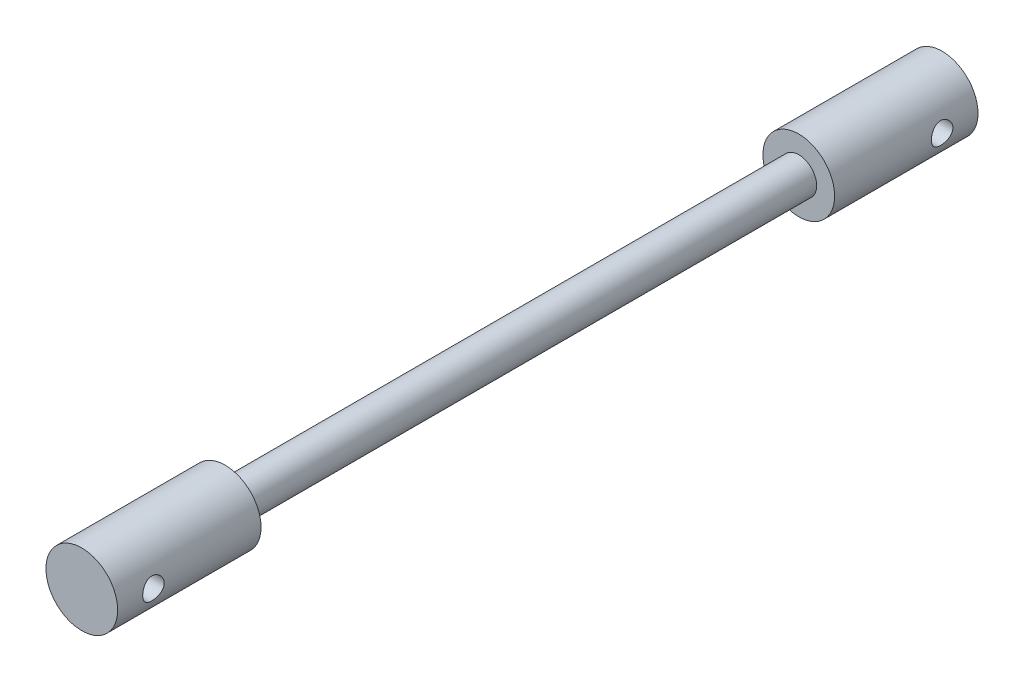
ISO-10303-21;
HEADER;
FILE_DESCRIPTION(('STEP AP214'),'2;1');
FILE_NAME('part.step','',(''),(''),'','','');
FILE_SCHEMA(('AUTOMOTIVE_DESIGN { 1 0 10303 214 1 1 1 1 }'));
ENDSEC;
DATA;
#1=APPLICATION_CONTEXT('core data for automotive mechanical design processes');
#2=APPLICATION_PROTOCOL_DEFINITION('international standard','automotive_design',2000,#1);
#3=PRODUCT_CONTEXT('',#1,'mechanical');
#4=PRODUCT('Part','Part','',(#3));
#5=PRODUCT_RELATED_PRODUCT_CATEGORY('part','',(#4));
#6=PRODUCT_DEFINITION_FORMATION('','',#4);
#7=PRODUCT_DEFINITION_CONTEXT('part definition',#1,'design');
#8=PRODUCT_DEFINITION('design','',#6,#7);
#9=PRODUCT_DEFINITION_SHAPE('','',#8);
#10=(LENGTH_UNIT() NAMED_UNIT(*) SI_UNIT(.MILLI.,.METRE.));
#11=(NAMED_UNIT(*) PLANE_ANGLE_UNIT() SI_UNIT($,.RADIAN.));
#12=(NAMED_UNIT(*) SI_UNIT($,.STERADIAN.) SOLID_ANGLE_UNIT());
#13=UNCERTAINTY_MEASURE_WITH_UNIT(LENGTH_MEASURE(1.E-05),#10,'distance_accuracy_value','');
#14=(GEOMETRIC_REPRESENTATION_CONTEXT(3) GLOBAL_UNCERTAINTY_ASSIGNED_CONTEXT((#13)) GLOBAL_UNIT_ASSIGNED_CONTEXT((#10,
#11,#12)) REPRESENTATION_CONTEXT('',''));
#15=CARTESIAN_POINT('',(0.,0.,0.));
#16=DIRECTION('',(0.,0.,1.));
#17=DIRECTION('',(1.,0.,0.));
#18=AXIS2_PLACEMENT_3D('',#15,#16,#17);
#19=CARTESIAN_POINT('',(0.,0.,20.));
#20=DIRECTION('',(0.,0.,1.));
#21=DIRECTION('',(1.,0.,0.));
#22=AXIS2_PLACEMENT_3D('',#19,#20,#21);
#23=PLANE('',#22);
#24=CARTESIAN_POINT('',(0.,0.,20.));
#25=DIRECTION('',(0.,0.,1.));
#26=DIRECTION('',(1.,0.,0.));
#27=AXIS2_PLACEMENT_3D('',#24,#25,#26);
#28=CIRCLE('',#27,5.);
#29=CARTESIAN_POINT('',(5.,0.,20.));
#30=VERTEX_POINT('',#29);
#31=EDGE_CURVE('E101',#30,#30,#28,.T.);
#32=ORIENTED_EDGE('',*,*,#31,.T.);
#33=EDGE_LOOP('',(#32));
#34=FACE_BOUND('',#33,.T.);
#35=CARTESIAN_POINT('',(0.,0.,20.));
#36=DIRECTION('',(0.,0.,1.));
#37=DIRECTION('',(1.,0.,0.));
#38=AXIS2_PLACEMENT_3D('',#35,#36,#37);
#39=CIRCLE('',#38,2.5);
#40=CARTESIAN_POINT('',(2.5,0.,20.));
#41=VERTEX_POINT('',#40);
#42=EDGE_CURVE('E102',#41,#41,#39,.T.);
#43=ORIENTED_EDGE('',*,*,#42,.F.);
#44=EDGE_LOOP('',(#43));
#45=FACE_BOUND('',#44,.T.);
#46=ADVANCED_FACE('F31',(#34,#45),#23,.T.);
#47=CARTESIAN_POINT('',(0.,0.,20.));
#48=DIRECTION('',(0.,0.,-1.));
#49=DIRECTION('',(-1.,0.,0.));
#50=AXIS2_PLACEMENT_3D('',#47,#48,#49);
#51=CYLINDRICAL_SURFACE('',#50,5.);
#52=CARTESIAN_POINT('',(-5.,0.,3.5));
#53=CARTESIAN_POINT('',(-4.9999992925055,0.0822886127532998,3.50000099748489));
#54=CARTESIAN_POINT('',(-4.99794915693954,0.164587318351529,3.50679386362397));
#55=CARTESIAN_POINT('',(-4.98997105593691,0.32678812530488,3.5337213542221));
#56=CARTESIAN_POINT('',(-4.98404193389692,0.406689504411419,3.55385995802334));
#57=CARTESIAN_POINT('',(-4.96895552501836,0.561732707754526,3.60674601691027));
#58=CARTESIAN_POINT('',(-4.95980300250425,0.636881364395372,3.63947486961894));
#59=CARTESIAN_POINT('',(-4.93922109237645,0.78062418105313,3.71653609305584));
#60=CARTESIAN_POINT('',(-4.92779140192067,0.849217467469668,3.76087000739542));
#61=CARTESIAN_POINT('',(-4.90350737192774,0.979871797183744,3.86122400747267));
#62=CARTESIAN_POINT('',(-4.89062383657036,1.04171807124434,3.91751662588591));
#63=CARTESIAN_POINT('',(-4.86505834210442,1.15524920923324,4.03960922991018));
#64=CARTESIAN_POINT('',(-4.85237641724501,1.20693236327441,4.10541081212496));
#65=CARTESIAN_POINT('',(-4.82834113993772,1.29980037723707,4.24647075303761));
#66=CARTESIAN_POINT('',(-4.81702406663875,1.34072309022213,4.32190846099074));
#67=CARTESIAN_POINT('',(-4.79743620394031,1.4092139477476,4.47898925423029));
#68=CARTESIAN_POINT('',(-4.78916468313311,1.43678529919973,4.56063084392798));
#69=CARTESIAN_POINT('',(-4.77690870838434,1.47701633682652,4.72539026613046));
#70=CARTESIAN_POINT('',(-4.77281069324533,1.49007196234677,4.80840274386394));
#71=CARTESIAN_POINT('',(-4.76902789749767,1.50213730614672,4.97553315621677));
#72=CARTESIAN_POINT('',(-4.76934204760571,1.50115042761078,5.05965081805909));
#73=CARTESIAN_POINT('',(-4.77424744067778,1.48546977199812,5.22338390860848));
#74=CARTESIAN_POINT('',(-4.77868388599141,1.47127205262685,5.30305225036224));
#75=CARTESIAN_POINT('',(-4.79108356228624,1.43037420427056,5.45881978627346));
#76=CARTESIAN_POINT('',(-4.79904714132351,1.40367284141641,5.53491862737433));
#77=CARTESIAN_POINT('',(-4.81772733074973,1.33816026653682,5.68260034966074));
#78=CARTESIAN_POINT('',(-4.82848016115952,1.29918816934642,5.75410708395526));
#79=CARTESIAN_POINT('',(-4.85150987000065,1.21035222588683,5.88973202201019));
#80=CARTESIAN_POINT('',(-4.86378711746991,1.16048574002588,5.95384842941378));
#81=CARTESIAN_POINT('',(-4.88911011297937,1.04881290765546,6.07568619076202));
#82=CARTESIAN_POINT('',(-4.90216654310498,0.986594907466971,6.13302866402967));
#83=CARTESIAN_POINT('',(-4.92712244063259,0.853263259313966,6.23655398406425));
#84=CARTESIAN_POINT('',(-4.9390218351841,0.782149051860887,6.28273612841443));
#85=CARTESIAN_POINT('',(-4.9604316006947,0.632355038342803,6.36285992246473));
#86=CARTESIAN_POINT('',(-4.96992543668314,0.55362774974795,6.39671751624986));
#87=CARTESIAN_POINT('',(-4.98533521832222,0.391245415603519,6.45059959009963));
#88=CARTESIAN_POINT('',(-4.99125216186999,0.307591751589581,6.47062792853249));
#89=CARTESIAN_POINT('',(-4.99868364643538,0.140952242668332,6.49565217789939));
#90=CARTESIAN_POINT('',(-5.0003485041779,0.0580500976011874,6.50116158580161));
#91=CARTESIAN_POINT('',(-4.9995292324176,-0.107499605823382,6.49843084428792));
#92=CARTESIAN_POINT('',(-4.99704565677756,-0.19014719669078,6.49019253034856));
#93=CARTESIAN_POINT('',(-4.98830696987163,-0.350903605309696,6.4606153888885));
#94=CARTESIAN_POINT('',(-4.98213829799417,-0.429072772614168,6.43957661241913));
#95=CARTESIAN_POINT('',(-4.96674347841533,-0.580754638954521,6.3853567672218));
#96=CARTESIAN_POINT('',(-4.95751696321085,-0.654266777025583,6.35217423896214));
#97=CARTESIAN_POINT('',(-4.93669654351325,-0.796437189461051,6.27374683451887));
#98=CARTESIAN_POINT('',(-4.92505280829675,-0.864943826199668,6.22824065905203));
#99=CARTESIAN_POINT('',(-4.90073468764318,-0.993523307980145,6.12677524594719));
#100=CARTESIAN_POINT('',(-4.8880600443108,-1.05359403235593,6.07081338811233));
#101=CARTESIAN_POINT('',(-4.86253171869138,-1.16585744551027,5.94761269163065));
#102=CARTESIAN_POINT('',(-4.84968825033268,-1.21768481231503,5.88003812422826));
#103=CARTESIAN_POINT('',(-4.82576515238464,-1.30928995072153,5.73687206098647));
#104=CARTESIAN_POINT('',(-4.81468547654651,-1.34906803829472,5.66128077544179));
#105=CARTESIAN_POINT('',(-4.79567189615055,-1.41517347127168,5.50446750874531));
#106=CARTESIAN_POINT('',(-4.78772337843827,-1.4415634693705,5.42327381346341));
#107=CARTESIAN_POINT('',(-4.77591594362794,-1.48021730815114,5.25731203106852));
#108=CARTESIAN_POINT('',(-4.772055625083,-1.49248598978779,5.17254517921233));
#109=CARTESIAN_POINT('',(-4.76899972496087,-1.50221984485059,5.00563848162377));
#110=CARTESIAN_POINT('',(-4.76961647442754,-1.5002805530849,4.92353634898241));
#111=CARTESIAN_POINT('',(-4.77499401288294,-1.48307505444813,4.7608858966272));
#112=CARTESIAN_POINT('',(-4.77975463592551,-1.46780938124716,4.68033751482365));
#113=CARTESIAN_POINT('',(-4.79275763670386,-1.42476888804136,4.52405460085715));
#114=CARTESIAN_POINT('',(-4.80095604545965,-1.39715175507068,4.44827271263831));
#115=CARTESIAN_POINT('',(-4.81990278909136,-1.33031507121129,4.30235756118228));
#116=CARTESIAN_POINT('',(-4.83065161194312,-1.29109329962876,4.23222538235924));
#117=CARTESIAN_POINT('',(-4.85397676425833,-1.20048763805072,4.09683688347289));
#118=CARTESIAN_POINT('',(-4.86660540163798,-1.14871276092994,4.03185123873959));
#119=CARTESIAN_POINT('',(-4.89201320450026,-1.03517434629782,3.91129750169214));
#120=CARTESIAN_POINT('',(-4.90479240823905,-0.973408217134501,3.85573186053224));
#121=CARTESIAN_POINT('',(-4.92950936570649,-0.839465762183248,3.75397658770497));
#122=CARTESIAN_POINT('',(-4.94141159765674,-0.767037885790608,3.70810855314451));
#123=CARTESIAN_POINT('',(-4.96260680455813,-0.615141373983529,3.62926483009598));
#124=CARTESIAN_POINT('',(-4.97190099931067,-0.535676052998955,3.59628311172549));
#125=CARTESIAN_POINT('',(-4.98602174969301,-0.380757712655282,3.54710472434725));
#126=CARTESIAN_POINT('',(-4.99122027381068,-0.305786961954234,3.52948832711675));
#127=CARTESIAN_POINT('',(-4.99820944494492,-0.15388019523078,3.50593647475842));
#128=CARTESIAN_POINT('',(-5.0000006615474,-0.0769445098581396,3.49999906729518));
#129=CARTESIAN_POINT('',(-5.,0.,3.5));
#130=B_SPLINE_CURVE_WITH_KNOTS('',3,(#52,#53,#54,#55,#56,#57,#58,#59,#60,#61,#62,#63,#64,#65,
#66,#67,#68,#69,#70,#71,#72,#73,#74,#75,#76,#77,#78,#79,#80,#81,#82,#83,#84,#85,#86,#87,#88,#89,
#90,#91,#92,#93,#94,#95,#96,#97,#98,#99,#100,#101,#102,#103,#104,#105,#106,#107,#108,#109,#110,
#111,#112,#113,#114,#115,#116,#117,#118,#119,#120,#121,#122,#123,#124,#125,#126,#127,#128,#129),
.UNSPECIFIED.,.T.,.F.,(4,2,2,2,2,2,2,2,2,2,2,2,2,2,2,2,2,2,2,2,2,2,2,2,2,2,2,2,2,2,2,2,2,2,2,2,
2,2,4),(0.,0.24658320361261,0.493239964845999,0.739533676300873,0.9858601644127,
1.23855602948191,1.49129437288633,1.74971481004109,2.00807314543223,2.25919689356599,
2.51025978319089,2.75226016697676,2.99428443658001,3.23962426447119,3.48502360158555,
3.74067104048166,3.99633456531071,4.25371046881688,4.51101453528807,4.75908809438544,
5.00712853550326,5.24956746682326,5.49203554593728,5.74011305702908,5.9882528200019,
6.24540400322818,6.5025484425268,6.75847814951251,7.01432009460282,7.25950155466942,
7.50467319661599,7.7468004040272,7.98897397553106,8.2399692567993,8.49102974897501,
8.7494299615667,9.00770911595234,9.23831691930458,9.46888616948873),.UNSPECIFIED.);
#131=CARTESIAN_POINT('',(-5.,0.,3.5));
#132=VERTEX_POINT('',#131);
#133=EDGE_CURVE('E47',#132,#132,#130,.T.);
#134=ORIENTED_EDGE('',*,*,#133,.T.);
#135=EDGE_LOOP('',(#134));
#136=FACE_BOUND('',#135,.T.);
#137=CARTESIAN_POINT('',(5.,0.,3.5));
#138=CARTESIAN_POINT('',(4.9999992925055,-0.0822886127532998,3.50000099748489));
#139=CARTESIAN_POINT('',(4.99794915693954,-0.164587318351529,3.50679386362397));
#140=CARTESIAN_POINT('',(4.98997105593691,-0.32678812530488,3.5337213542221));
#141=CARTESIAN_POINT('',(4.98404193389692,-0.406689504411419,3.55385995802334));
#142=CARTESIAN_POINT('',(4.96895552501836,-0.561732707754526,3.60674601691027));
#143=CARTESIAN_POINT('',(4.95980300250425,-0.636881364395372,3.63947486961894));
#144=CARTESIAN_POINT('',(4.93922109237645,-0.78062418105313,3.71653609305584));
#145=CARTESIAN_POINT('',(4.92779140192067,-0.849217467469668,3.76087000739542));
#146=CARTESIAN_POINT('',(4.90350737192774,-0.979871797183744,3.86122400747267));
#147=CARTESIAN_POINT('',(4.89062383657036,-1.04171807124434,3.91751662588591));
#148=CARTESIAN_POINT('',(4.86505834210442,-1.15524920923324,4.03960922991018));
#149=CARTESIAN_POINT('',(4.85237641724501,-1.20693236327441,4.10541081212496));
#150=CARTESIAN_POINT('',(4.82834113993772,-1.29980037723707,4.24647075303761));
#151=CARTESIAN_POINT('',(4.81702406663875,-1.34072309022213,4.32190846099074));
#152=CARTESIAN_POINT('',(4.79743620394031,-1.4092139477476,4.47898925423029));
#153=CARTESIAN_POINT('',(4.78916468313311,-1.43678529919973,4.56063084392798));
#154=CARTESIAN_POINT('',(4.77690870838434,-1.47701633682652,4.72539026613046));
#155=CARTESIAN_POINT('',(4.77281069324533,-1.49007196234677,4.80840274386394));
#156=CARTESIAN_POINT('',(4.76902789749767,-1.50213730614672,4.97553315621677));
#157=CARTESIAN_POINT('',(4.76934204760571,-1.50115042761078,5.05965081805909));
#158=CARTESIAN_POINT('',(4.77424744067778,-1.48546977199812,5.22338390860848));
#159=CARTESIAN_POINT('',(4.77868388599141,-1.47127205262685,5.30305225036224));
#160=CARTESIAN_POINT('',(4.79108356228624,-1.43037420427056,5.45881978627346));
#161=CARTESIAN_POINT('',(4.79904714132351,-1.40367284141641,5.53491862737433));
#162=CARTESIAN_POINT('',(4.81772733074973,-1.33816026653682,5.68260034966074));
#163=CARTESIAN_POINT('',(4.82848016115952,-1.29918816934642,5.75410708395526));
#164=CARTESIAN_POINT('',(4.85150987000065,-1.21035222588683,5.88973202201019));
#165=CARTESIAN_POINT('',(4.86378711746991,-1.16048574002588,5.95384842941378));
#166=CARTESIAN_POINT('',(4.88911011297937,-1.04881290765546,6.07568619076202));
#167=CARTESIAN_POINT('',(4.90216654310498,-0.986594907466971,6.13302866402967));
#168=CARTESIAN_POINT('',(4.92712244063259,-0.853263259313966,6.23655398406425));
#169=CARTESIAN_POINT('',(4.9390218351841,-0.782149051860887,6.28273612841443));
#170=CARTESIAN_POINT('',(4.9604316006947,-0.632355038342803,6.36285992246473));
#171=CARTESIAN_POINT('',(4.96992543668314,-0.55362774974795,6.39671751624986));
#172=CARTESIAN_POINT('',(4.98533521832222,-0.391245415603519,6.45059959009963));
#173=CARTESIAN_POINT('',(4.99125216186999,-0.307591751589581,6.47062792853249));
#174=CARTESIAN_POINT('',(4.99868364643538,-0.140952242668332,6.49565217789939));
#175=CARTESIAN_POINT('',(5.0003485041779,-0.0580500976011874,6.50116158580161));
#176=CARTESIAN_POINT('',(4.9995292324176,0.107499605823382,6.49843084428792));
#177=CARTESIAN_POINT('',(4.99704565677756,0.19014719669078,6.49019253034856));
#178=CARTESIAN_POINT('',(4.98830696987163,0.350903605309696,6.4606153888885));
#179=CARTESIAN_POINT('',(4.98213829799417,0.429072772614168,6.43957661241913));
#180=CARTESIAN_POINT('',(4.96674347841533,0.580754638954521,6.3853567672218));
#181=CARTESIAN_POINT('',(4.95751696321085,0.654266777025583,6.35217423896214));
#182=CARTESIAN_POINT('',(4.93669654351325,0.796437189461051,6.27374683451887));
#183=CARTESIAN_POINT('',(4.92505280829675,0.864943826199668,6.22824065905203));
#184=CARTESIAN_POINT('',(4.90073468764318,0.993523307980145,6.12677524594719));
#185=CARTESIAN_POINT('',(4.8880600443108,1.05359403235593,6.07081338811233));
#186=CARTESIAN_POINT('',(4.86253171869138,1.16585744551027,5.94761269163065));
#187=CARTESIAN_POINT('',(4.84968825033268,1.21768481231503,5.88003812422826));
#188=CARTESIAN_POINT('',(4.82576515238464,1.30928995072153,5.73687206098647));
#189=CARTESIAN_POINT('',(4.81468547654651,1.34906803829472,5.66128077544179));
#190=CARTESIAN_POINT('',(4.79567189615055,1.41517347127168,5.50446750874531));
#191=CARTESIAN_POINT('',(4.78772337843827,1.4415634693705,5.42327381346341));
#192=CARTESIAN_POINT('',(4.77591594362794,1.48021730815114,5.25731203106852));
#193=CARTESIAN_POINT('',(4.772055625083,1.49248598978779,5.17254517921233));
#194=CARTESIAN_POINT('',(4.76899972496087,1.50221984485059,5.00563848162377));
#195=CARTESIAN_POINT('',(4.76961647442754,1.5002805530849,4.92353634898241));
#196=CARTESIAN_POINT('',(4.77499401288294,1.48307505444813,4.7608858966272));
#197=CARTESIAN_POINT('',(4.77975463592551,1.46780938124716,4.68033751482365));
#198=CARTESIAN_POINT('',(4.79275763670386,1.42476888804136,4.52405460085715));
#199=CARTESIAN_POINT('',(4.80095604545965,1.39715175507068,4.44827271263831));
#200=CARTESIAN_POINT('',(4.81990278909136,1.33031507121129,4.30235756118228));
#201=CARTESIAN_POINT('',(4.83065161194312,1.29109329962876,4.23222538235924));
#202=CARTESIAN_POINT('',(4.85397676425833,1.20048763805072,4.09683688347289));
#203=CARTESIAN_POINT('',(4.86660540163798,1.14871276092994,4.03185123873959));
#204=CARTESIAN_POINT('',(4.89201320450026,1.03517434629782,3.91129750169214));
#205=CARTESIAN_POINT('',(4.90479240823905,0.973408217134501,3.85573186053224));
#206=CARTESIAN_POINT('',(4.92950936570649,0.839465762183248,3.75397658770497));
#207=CARTESIAN_POINT('',(4.94141159765674,0.767037885790608,3.70810855314451));
#208=CARTESIAN_POINT('',(4.96260680455813,0.615141373983529,3.62926483009598));
#209=CARTESIAN_POINT('',(4.97190099931067,0.535676052998955,3.59628311172549));
#210=CARTESIAN_POINT('',(4.98602174969301,0.380757712655282,3.54710472434725));
#211=CARTESIAN_POINT('',(4.99122027381068,0.305786961954234,3.52948832711675));
#212=CARTESIAN_POINT('',(4.99820944494492,0.15388019523078,3.50593647475842));
#213=CARTESIAN_POINT('',(5.0000006615474,0.0769445098581396,3.49999906729518));
#214=CARTESIAN_POINT('',(5.,0.,3.5));
#215=B_SPLINE_CURVE_WITH_KNOTS('',3,(#137,#138,#139,#140,#141,#142,#143,#144,#145,#146,#147,
#148,#149,#150,#151,#152,#153,#154,#155,#156,#157,#158,#159,#160,#161,#162,#163,#164,#165,#166,
#167,#168,#169,#170,#171,#172,#173,#174,#175,#176,#177,#178,#179,#180,#181,#182,#183,#184,#185,
#186,#187,#188,#189,#190,#191,#192,#193,#194,#195,#196,#197,#198,#199,#200,#201,#202,#203,#204,
#205,#206,#207,#208,#209,#210,#211,#212,#213,#214),.UNSPECIFIED.,.T.,.F.,(4,2,2,2,2,2,2,2,2,2,2,
2,2,2,2,2,2,2,2,2,2,2,2,2,2,2,2,2,2,2,2,2,2,2,2,2,2,2,4),(0.,0.24658320361261,0.493239964845999,
0.739533676300873,0.9858601644127,1.23855602948191,1.49129437288633,1.74971481004109,
2.00807314543223,2.25919689356599,2.51025978319089,2.75226016697676,2.99428443658001,
3.23962426447119,3.48502360158555,3.74067104048166,3.99633456531071,4.25371046881688,
4.51101453528807,4.75908809438544,5.00712853550326,5.24956746682326,5.49203554593728,
5.74011305702908,5.9882528200019,6.24540400322818,6.5025484425268,6.75847814951251,
7.01432009460282,7.25950155466942,7.50467319661599,7.7468004040272,7.98897397553106,
8.2399692567993,8.49102974897501,8.7494299615667,9.00770911595234,9.23831691930458,
9.46888616948873),.UNSPECIFIED.);
#216=CARTESIAN_POINT('',(5.,0.,3.5));
#217=VERTEX_POINT('',#216);
#218=EDGE_CURVE('E51',#217,#217,#215,.T.);
#219=ORIENTED_EDGE('',*,*,#218,.T.);
#220=EDGE_LOOP('',(#219));
#221=FACE_BOUND('',#220,.T.);
#222=ORIENTED_EDGE('',*,*,#31,.F.);
#223=EDGE_LOOP('',(#222));
#224=FACE_BOUND('',#223,.T.);
#225=CARTESIAN_POINT('',(0.,0.,0.));
#226=DIRECTION('',(0.,0.,1.));
#227=DIRECTION('',(1.,0.,0.));
#228=AXIS2_PLACEMENT_3D('',#225,#226,#227);
#229=CIRCLE('',#228,5.);
#230=CARTESIAN_POINT('',(5.,0.,0.));
#231=VERTEX_POINT('',#230);
#232=EDGE_CURVE('E99',#231,#231,#229,.T.);
#233=ORIENTED_EDGE('',*,*,#232,.T.);
#234=EDGE_LOOP('',(#233));
#235=FACE_BOUND('',#234,.T.);
#236=ADVANCED_FACE('F33',(#136,#221,#224,#235),#51,.T.);
#237=CARTESIAN_POINT('',(0.,0.,0.));
#238=DIRECTION('',(0.,0.,1.));
#239=DIRECTION('',(1.,0.,0.));
#240=AXIS2_PLACEMENT_3D('',#237,#238,#239);
#241=PLANE('',#240);
#242=ORIENTED_EDGE('',*,*,#232,.F.);
#243=EDGE_LOOP('',(#242));
#244=FACE_BOUND('',#243,.T.);
#245=ADVANCED_FACE('F85',(#244),#241,.F.);
#246=CARTESIAN_POINT('',(0.,0.,60.));
#247=DIRECTION('',(0.,0.,-1.));
#248=DIRECTION('',(-1.,0.,0.));
#249=AXIS2_PLACEMENT_3D('',#246,#247,#248);
#250=CYLINDRICAL_SURFACE('',#249,2.5);
#251=ORIENTED_EDGE('',*,*,#42,.T.);
#252=EDGE_LOOP('',(#251));
#253=FACE_BOUND('',#252,.T.);
#254=CARTESIAN_POINT('',(0.,0.,100.));
#255=DIRECTION('',(0.,0.,1.));
#256=DIRECTION('',(1.,0.,0.));
#257=AXIS2_PLACEMENT_3D('',#254,#255,#256);
#258=CIRCLE('',#257,2.5);
#259=CARTESIAN_POINT('',(2.5,0.,100.));
#260=VERTEX_POINT('',#259);
#261=EDGE_CURVE('E106',#260,#260,#258,.T.);
#262=ORIENTED_EDGE('',*,*,#261,.F.);
#263=EDGE_LOOP('',(#262));
#264=FACE_BOUND('',#263,.T.);
#265=ADVANCED_FACE('F90',(#253,#264),#250,.T.);
#266=CARTESIAN_POINT('',(-5.,0.,5.));
#267=DIRECTION('',(1.,0.,0.));
#268=DIRECTION('',(0.,0.,-1.));
#269=AXIS2_PLACEMENT_3D('',#266,#267,#268);
#270=CYLINDRICAL_SURFACE('',#269,1.5);
#271=ORIENTED_EDGE('',*,*,#218,.F.);
#272=EDGE_LOOP('',(#271));
#273=FACE_BOUND('',#272,.T.);
#274=ORIENTED_EDGE('',*,*,#133,.F.);
#275=EDGE_LOOP('',(#274));
#276=FACE_BOUND('',#275,.T.);
#277=ADVANCED_FACE('F70',(#273,#276),#270,.F.);
#278=CARTESIAN_POINT('',(0.,0.,100.));
#279=DIRECTION('',(0.,0.,-1.));
#280=DIRECTION('',(1.,0.,0.));
#281=AXIS2_PLACEMENT_3D('',#278,#279,#280);
#282=PLANE('',#281);
#283=CARTESIAN_POINT('',(0.,0.,100.));
#284=DIRECTION('',(0.,0.,1.));
#285=DIRECTION('',(1.,0.,0.));
#286=AXIS2_PLACEMENT_3D('',#283,#284,#285);
#287=CIRCLE('',#286,5.);
#288=CARTESIAN_POINT('',(5.,0.,100.));
#289=VERTEX_POINT('',#288);
#290=EDGE_CURVE('E175',#289,#289,#287,.T.);
#291=ORIENTED_EDGE('',*,*,#290,.F.);
#292=EDGE_LOOP('',(#291));
#293=FACE_BOUND('',#292,.T.);
#294=ORIENTED_EDGE('',*,*,#261,.T.);
#295=EDGE_LOOP('',(#294));
#296=FACE_BOUND('',#295,.T.);
#297=ADVANCED_FACE('F67',(#293,#296),#282,.T.);
#298=CARTESIAN_POINT('',(0.,0.,100.));
#299=DIRECTION('',(0.,0.,1.));
#300=DIRECTION('',(1.,0.,0.));
#301=AXIS2_PLACEMENT_3D('',#298,#299,#300);
#302=CYLINDRICAL_SURFACE('',#301,5.);
#303=CARTESIAN_POINT('',(-5.,0.,113.5));
#304=CARTESIAN_POINT('',(-4.9999992925055,-0.082288612753314,113.500000997485));
#305=CARTESIAN_POINT('',(-4.99794915693954,-0.164587318351543,113.506793863624));
#306=CARTESIAN_POINT('',(-4.98997105593691,-0.326788125304895,113.533721354222));
#307=CARTESIAN_POINT('',(-4.98404193389692,-0.406689504411434,113.553859958023));
#308=CARTESIAN_POINT('',(-4.96895552501836,-0.561732707754539,113.60674601691));
#309=CARTESIAN_POINT('',(-4.95980300250425,-0.636881364395385,113.639474869619));
#310=CARTESIAN_POINT('',(-4.93922109237645,-0.780624181053145,113.716536093056));
#311=CARTESIAN_POINT('',(-4.92779140192066,-0.849217467469685,113.760870007395));
#312=CARTESIAN_POINT('',(-4.90350737192774,-0.979871797183764,113.861224007473));
#313=CARTESIAN_POINT('',(-4.89062383657036,-1.04171807124436,113.917516625886));
#314=CARTESIAN_POINT('',(-4.86505834210442,-1.15524920923325,114.03960922991));
#315=CARTESIAN_POINT('',(-4.85237641724501,-1.20693236327442,114.105410812125));
#316=CARTESIAN_POINT('',(-4.82834113993772,-1.29980037723709,114.246470753038));
#317=CARTESIAN_POINT('',(-4.81702406663874,-1.34072309022215,114.321908460991));
#318=CARTESIAN_POINT('',(-4.79743620394031,-1.40921394774762,114.47898925423));
#319=CARTESIAN_POINT('',(-4.7891646831331,-1.43678529919974,114.560630843928));
#320=CARTESIAN_POINT('',(-4.77690870838434,-1.47701633682653,114.72539026613));
#321=CARTESIAN_POINT('',(-4.77281069324533,-1.49007196234679,114.808402743864));
#322=CARTESIAN_POINT('',(-4.76902789749767,-1.50213730614673,114.975533156217));
#323=CARTESIAN_POINT('',(-4.76934204760571,-1.50115042761079,115.059650818059));
#324=CARTESIAN_POINT('',(-4.77424744067777,-1.48546977199813,115.223383908608));
#325=CARTESIAN_POINT('',(-4.7786838859914,-1.47127205262686,115.303052250362));
#326=CARTESIAN_POINT('',(-4.79108356228624,-1.43037420427057,115.458819786273));
#327=CARTESIAN_POINT('',(-4.7990471413235,-1.40367284141642,115.534918627374));
#328=CARTESIAN_POINT('',(-4.81772733074973,-1.33816026653683,115.682600349661));
#329=CARTESIAN_POINT('',(-4.82848016115952,-1.29918816934644,115.754107083955));
#330=CARTESIAN_POINT('',(-4.85150987000064,-1.21035222588684,115.88973202201));
#331=CARTESIAN_POINT('',(-4.86378711746991,-1.16048574002589,115.953848429414));
#332=CARTESIAN_POINT('',(-4.88911011297937,-1.04881290765546,116.075686190762));
#333=CARTESIAN_POINT('',(-4.90216654310498,-0.986594907466975,116.13302866403));
#334=CARTESIAN_POINT('',(-4.92712244063258,-0.853263259313976,116.236553984064));
#335=CARTESIAN_POINT('',(-4.9390218351841,-0.7821490518609,116.282736128414));
#336=CARTESIAN_POINT('',(-4.9604316006947,-0.632355038342815,116.362859922465));
#337=CARTESIAN_POINT('',(-4.96992543668314,-0.553627749747959,116.39671751625));
#338=CARTESIAN_POINT('',(-4.98533521832222,-0.391245415603526,116.4505995901));
#339=CARTESIAN_POINT('',(-4.99125216186999,-0.30759175158959,116.470627928532));
#340=CARTESIAN_POINT('',(-4.99868364643538,-0.140952242668342,116.495652177899));
#341=CARTESIAN_POINT('',(-5.0003485041779,-0.0580500976011978,116.501161585802));
#342=CARTESIAN_POINT('',(-4.9995292324176,0.107499605823372,116.498430844288));
#343=CARTESIAN_POINT('',(-4.99704565677756,0.19014719669077,116.490192530349));
#344=CARTESIAN_POINT('',(-4.98830696987163,0.350903605309684,116.460615388888));
#345=CARTESIAN_POINT('',(-4.98213829799417,0.429072772614154,116.439576612419));
#346=CARTESIAN_POINT('',(-4.96674347841533,0.580754638954507,116.385356767222));
#347=CARTESIAN_POINT('',(-4.95751696321085,0.654266777025571,116.352174238962));
#348=CARTESIAN_POINT('',(-4.93669654351325,0.79643718946104,116.273746834519));
#349=CARTESIAN_POINT('',(-4.92505280829675,0.864943826199657,116.228240659052));
#350=CARTESIAN_POINT('',(-4.90073468764318,0.993523307980133,116.126775245947));
#351=CARTESIAN_POINT('',(-4.8880600443108,1.05359403235592,116.070813388112));
#352=CARTESIAN_POINT('',(-4.86253171869138,1.16585744551026,115.947612691631));
#353=CARTESIAN_POINT('',(-4.84968825033268,1.21768481231503,115.880038124228));
#354=CARTESIAN_POINT('',(-4.82576515238464,1.30928995072153,115.736872060986));
#355=CARTESIAN_POINT('',(-4.81468547654652,1.34906803829471,115.661280775442));
#356=CARTESIAN_POINT('',(-4.79567189615055,1.41517347127167,115.504467508745));
#357=CARTESIAN_POINT('',(-4.78772337843827,1.44156346937048,115.423273813463));
#358=CARTESIAN_POINT('',(-4.77591594362795,1.48021730815113,115.257312031069));
#359=CARTESIAN_POINT('',(-4.77205562508301,1.49248598978777,115.172545179212));
#360=CARTESIAN_POINT('',(-4.76899972496087,1.50221984485057,115.005638481624));
#361=CARTESIAN_POINT('',(-4.76961647442755,1.50028055308488,114.923536348982));
#362=CARTESIAN_POINT('',(-4.77499401288295,1.48307505444812,114.760885896627));
#363=CARTESIAN_POINT('',(-4.77975463592552,1.46780938124715,114.680337514824));
#364=CARTESIAN_POINT('',(-4.79275763670386,1.42476888804135,114.524054600857));
#365=CARTESIAN_POINT('',(-4.80095604545965,1.39715175507067,114.448272712638));
#366=CARTESIAN_POINT('',(-4.81990278909137,1.33031507121128,114.302357561182));
#367=CARTESIAN_POINT('',(-4.83065161194312,1.29109329962875,114.232225382359));
#368=CARTESIAN_POINT('',(-4.85397676425833,1.20048763805071,114.096836883473));
#369=CARTESIAN_POINT('',(-4.86660540163798,1.14871276092992,114.03185123874));
#370=CARTESIAN_POINT('',(-4.89201320450026,1.0351743462978,113.911297501692));
#371=CARTESIAN_POINT('',(-4.90479240823905,0.97340821713449,113.855731860532));
#372=CARTESIAN_POINT('',(-4.92950936570649,0.839465762183239,113.753976587705));
#373=CARTESIAN_POINT('',(-4.94141159765674,0.767037885790598,113.708108553144));
#374=CARTESIAN_POINT('',(-4.96260680455813,0.615141373983517,113.629264830096));
#375=CARTESIAN_POINT('',(-4.97190099931067,0.53567605299894,113.596283111725));
#376=CARTESIAN_POINT('',(-4.98602174969301,0.380757712655264,113.547104724347));
#377=CARTESIAN_POINT('',(-4.99122027381068,0.305786961954217,113.529488327117));
#378=CARTESIAN_POINT('',(-4.99820944494492,0.153880195230764,113.505936474758));
#379=CARTESIAN_POINT('',(-5.0000006615474,0.0769445098581245,113.499999067295));
#380=CARTESIAN_POINT('',(-5.,0.,113.5));
#381=B_SPLINE_CURVE_WITH_KNOTS('',3,(#303,#304,#305,#306,#307,#308,#309,#310,#311,#312,#313,
#314,#315,#316,#317,#318,#319,#320,#321,#322,#323,#324,#325,#326,#327,#328,#329,#330,#331,#332,
#333,#334,#335,#336,#337,#338,#339,#340,#341,#342,#343,#344,#345,#346,#347,#348,#349,#350,#351,
#352,#353,#354,#355,#356,#357,#358,#359,#360,#361,#362,#363,#364,#365,#366,#367,#368,#369,#370,
#371,#372,#373,#374,#375,#376,#377,#378,#379,#380),.UNSPECIFIED.,.T.,.F.,(4,2,2,2,2,2,2,2,2,2,2,
2,2,2,2,2,2,2,2,2,2,2,2,2,2,2,2,2,2,2,2,2,2,2,2,2,2,2,4),(0.,0.24658320361261,0.493239964846001,
0.73953367630087,0.985860164412703,1.23855602948192,1.49129437288633,1.74971481004109,
2.00807314543223,2.259196893566,2.51025978319088,2.75226016697675,2.99428443658,
3.23962426447121,3.48502360158557,3.74067104048167,3.99633456531071,4.25371046881689,
4.51101453528808,4.75908809438545,5.00712853550327,5.24956746682326,5.49203554593728,
5.74011305702908,5.98825282000191,6.24540400322819,6.5025484425268,6.75847814951251,
7.01432009460282,7.25950155466941,7.50467319661598,7.74680040402719,7.98897397553106,
8.23996925679929,8.491029748975,8.74942996156669,9.00770911595234,9.23831691930458,
9.46888616948873),.UNSPECIFIED.);
#382=CARTESIAN_POINT('',(-5.,0.,113.5));
#383=VERTEX_POINT('',#382);
#384=EDGE_CURVE('E10',#383,#383,#381,.T.);
#385=ORIENTED_EDGE('',*,*,#384,.F.);
#386=EDGE_LOOP('',(#385));
#387=FACE_BOUND('',#386,.T.);
#388=CARTESIAN_POINT('',(5.,0.,113.5));
#389=CARTESIAN_POINT('',(4.9999992925055,0.0822886127532995,113.500000997485));
#390=CARTESIAN_POINT('',(4.99794915693954,0.164587318351529,113.506793863624));
#391=CARTESIAN_POINT('',(4.98997105593691,0.326788125304879,113.533721354222));
#392=CARTESIAN_POINT('',(4.98404193389692,0.406689504411418,113.553859958023));
#393=CARTESIAN_POINT('',(4.96895552501836,0.561732707754526,113.60674601691));
#394=CARTESIAN_POINT('',(4.95980300250425,0.636881364395373,113.639474869619));
#395=CARTESIAN_POINT('',(4.93922109237645,0.780624181053131,113.716536093056));
#396=CARTESIAN_POINT('',(4.92779140192067,0.849217467469668,113.760870007395));
#397=CARTESIAN_POINT('',(4.90350737192774,0.979871797183741,113.861224007473));
#398=CARTESIAN_POINT('',(4.89062383657036,1.04171807124434,113.917516625886));
#399=CARTESIAN_POINT('',(4.86505834210442,1.15524920923323,114.03960922991));
#400=CARTESIAN_POINT('',(4.85237641724502,1.2069323632744,114.105410812125));
#401=CARTESIAN_POINT('',(4.82834113993772,1.29980037723707,114.246470753038));
#402=CARTESIAN_POINT('',(4.81702406663875,1.34072309022212,114.321908460991));
#403=CARTESIAN_POINT('',(4.79743620394031,1.40921394774759,114.47898925423));
#404=CARTESIAN_POINT('',(4.78916468313311,1.43678529919972,114.560630843928));
#405=CARTESIAN_POINT('',(4.77690870838435,1.4770163368265,114.72539026613));
#406=CARTESIAN_POINT('',(4.77281069324534,1.49007196234676,114.808402743864));
#407=CARTESIAN_POINT('',(4.76902789749768,1.5021373061467,114.975533156217));
#408=CARTESIAN_POINT('',(4.76934204760572,1.50115042761077,115.059650818059));
#409=CARTESIAN_POINT('',(4.77424744067778,1.4854697719981,115.223383908608));
#410=CARTESIAN_POINT('',(4.77868388599141,1.47127205262684,115.303052250362));
#411=CARTESIAN_POINT('',(4.79108356228625,1.43037420427054,115.458819786273));
#412=CARTESIAN_POINT('',(4.79904714132351,1.40367284141639,115.534918627374));
#413=CARTESIAN_POINT('',(4.81772733074974,1.33816026653679,115.682600349661));
#414=CARTESIAN_POINT('',(4.82848016115953,1.2991881693464,115.754107083955));
#415=CARTESIAN_POINT('',(4.85150987000065,1.21035222588681,115.88973202201));
#416=CARTESIAN_POINT('',(4.86378711746992,1.16048574002586,115.953848429414));
#417=CARTESIAN_POINT('',(4.88911011297938,1.04881290765543,116.075686190762));
#418=CARTESIAN_POINT('',(4.90216654310499,0.986594907466944,116.13302866403));
#419=CARTESIAN_POINT('',(4.92712244063259,0.853263259313938,116.236553984064));
#420=CARTESIAN_POINT('',(4.93902183518411,0.782149051860857,116.282736128414));
#421=CARTESIAN_POINT('',(4.96043160069471,0.632355038342771,116.362859922465));
#422=CARTESIAN_POINT('',(4.96992543668314,0.55362774974792,116.39671751625));
#423=CARTESIAN_POINT('',(4.98533521832222,0.391245415603491,116.4505995901));
#424=CARTESIAN_POINT('',(4.99125216186999,0.307591751589555,116.470627928532));
#425=CARTESIAN_POINT('',(4.99868364643538,0.140952242668306,116.495652177899));
#426=CARTESIAN_POINT('',(5.0003485041779,0.058050097601161,116.501161585802));
#427=CARTESIAN_POINT('',(4.99952923241759,-0.10749960582341,116.498430844288));
#428=CARTESIAN_POINT('',(4.99704565677756,-0.190147196690808,116.490192530349));
#429=CARTESIAN_POINT('',(4.98830696987163,-0.350903605309725,116.460615388888));
#430=CARTESIAN_POINT('',(4.98213829799416,-0.429072772614198,116.439576612419));
#431=CARTESIAN_POINT('',(4.96674347841532,-0.580754638954548,116.385356767222));
#432=CARTESIAN_POINT('',(4.95751696321084,-0.654266777025608,116.352174238962));
#433=CARTESIAN_POINT('',(4.93669654351324,-0.796437189461077,116.273746834519));
#434=CARTESIAN_POINT('',(4.92505280829674,-0.864943826199696,116.228240659052));
#435=CARTESIAN_POINT('',(4.90073468764317,-0.993523307980172,116.126775245947));
#436=CARTESIAN_POINT('',(4.8880600443108,-1.05359403235596,116.070813388112));
#437=CARTESIAN_POINT('',(4.86253171869137,-1.16585744551029,115.947612691631));
#438=CARTESIAN_POINT('',(4.84968825033267,-1.21768481231505,115.880038124228));
#439=CARTESIAN_POINT('',(4.82576515238463,-1.30928995072155,115.736872060986));
#440=CARTESIAN_POINT('',(4.81468547654651,-1.34906803829474,115.661280775442));
#441=CARTESIAN_POINT('',(4.79567189615054,-1.4151734712717,115.504467508745));
#442=CARTESIAN_POINT('',(4.78772337843826,-1.44156346937052,115.423273813463));
#443=CARTESIAN_POINT('',(4.77591594362794,-1.48021730815116,115.257312031068));
#444=CARTESIAN_POINT('',(4.772055625083,-1.4924859897878,115.172545179212));
#445=CARTESIAN_POINT('',(4.76899972496086,-1.5022198448506,115.005638481624));
#446=CARTESIAN_POINT('',(4.76961647442754,-1.50028055308491,114.923536348982));
#447=CARTESIAN_POINT('',(4.77499401288294,-1.48307505444814,114.760885896627));
#448=CARTESIAN_POINT('',(4.77975463592551,-1.46780938124717,114.680337514824));
#449=CARTESIAN_POINT('',(4.79275763670385,-1.42476888804137,114.524054600857));
#450=CARTESIAN_POINT('',(4.80095604545964,-1.39715175507069,114.448272712638));
#451=CARTESIAN_POINT('',(4.81990278909136,-1.3303150712113,114.302357561182));
#452=CARTESIAN_POINT('',(4.83065161194312,-1.29109329962877,114.232225382359));
#453=CARTESIAN_POINT('',(4.85397676425833,-1.20048763805073,114.096836883473));
#454=CARTESIAN_POINT('',(4.86660540163797,-1.14871276092994,114.03185123874));
#455=CARTESIAN_POINT('',(4.89201320450026,-1.03517434629782,113.911297501692));
#456=CARTESIAN_POINT('',(4.90479240823905,-0.973408217134504,113.855731860532));
#457=CARTESIAN_POINT('',(4.92950936570649,-0.839465762183247,113.753976587705));
#458=CARTESIAN_POINT('',(4.94141159765674,-0.767037885790604,113.708108553144));
#459=CARTESIAN_POINT('',(4.96260680455813,-0.615141373983525,113.629264830096));
#460=CARTESIAN_POINT('',(4.97190099931066,-0.535676052998952,113.596283111725));
#461=CARTESIAN_POINT('',(4.98602174969301,-0.380757712655279,113.547104724347));
#462=CARTESIAN_POINT('',(4.99122027381068,-0.305786961954232,113.529488327117));
#463=CARTESIAN_POINT('',(4.99820944494492,-0.153880195230778,113.505936474758));
#464=CARTESIAN_POINT('',(5.0000006615474,-0.076944509858139,113.499999067295));
#465=CARTESIAN_POINT('',(5.,0.,113.5));
#466=B_SPLINE_CURVE_WITH_KNOTS('',3,(#388,#389,#390,#391,#392,#393,#394,#395,#396,#397,#398,
#399,#400,#401,#402,#403,#404,#405,#406,#407,#408,#409,#410,#411,#412,#413,#414,#415,#416,#417,
#418,#419,#420,#421,#422,#423,#424,#425,#426,#427,#428,#429,#430,#431,#432,#433,#434,#435,#436,
#437,#438,#439,#440,#441,#442,#443,#444,#445,#446,#447,#448,#449,#450,#451,#452,#453,#454,#455,
#456,#457,#458,#459,#460,#461,#462,#463,#464,#465),.UNSPECIFIED.,.T.,.F.,(4,2,2,2,2,2,2,2,2,2,2,
2,2,2,2,2,2,2,2,2,2,2,2,2,2,2,2,2,2,2,2,2,2,2,2,2,2,2,4),(0.,0.24658320361261,0.493239964845999,
0.739533676300879,0.985860164412703,1.23855602948192,1.49129437288633,1.74971481004108,
2.00807314543223,2.25919689356599,2.51025978319088,2.75226016697674,2.99428443658,
3.23962426447119,3.48502360158555,3.74067104048166,3.99633456531071,4.25371046881688,
4.51101453528807,4.75908809438544,5.00712853550326,5.24956746682326,5.49203554593728,
5.74011305702907,5.9882528200019,6.24540400322817,6.5025484425268,6.75847814951252,
7.01432009460282,7.2595015546694,7.50467319661598,7.7468004040272,7.98897397553106,
8.23996925679929,8.49102974897501,8.74942996156669,9.00770911595234,9.23831691930458,
9.46888616948873),.UNSPECIFIED.);
#467=CARTESIAN_POINT('',(5.,0.,113.5));
#468=VERTEX_POINT('',#467);
#469=EDGE_CURVE('E43',#468,#468,#466,.T.);
#470=ORIENTED_EDGE('',*,*,#469,.F.);
#471=EDGE_LOOP('',(#470));
#472=FACE_BOUND('',#471,.T.);
#473=ORIENTED_EDGE('',*,*,#290,.T.);
#474=EDGE_LOOP('',(#473));
#475=FACE_BOUND('',#474,.T.);
#476=CARTESIAN_POINT('',(0.,0.,120.));
#477=DIRECTION('',(0.,0.,1.));
#478=DIRECTION('',(1.,0.,0.));
#479=AXIS2_PLACEMENT_3D('',#476,#477,#478);
#480=CIRCLE('',#479,5.);
#481=CARTESIAN_POINT('',(5.,0.,120.));
#482=VERTEX_POINT('',#481);
#483=EDGE_CURVE('E176',#482,#482,#480,.T.);
#484=ORIENTED_EDGE('',*,*,#483,.F.);
#485=EDGE_LOOP('',(#484));
#486=FACE_BOUND('',#485,.T.);
#487=ADVANCED_FACE('F59',(#387,#472,#475,#486),#302,.T.);
#488=CARTESIAN_POINT('',(0.,0.,120.));
#489=DIRECTION('',(0.,0.,-1.));
#490=DIRECTION('',(1.,0.,0.));
#491=AXIS2_PLACEMENT_3D('',#488,#489,#490);
#492=PLANE('',#491);
#493=ORIENTED_EDGE('',*,*,#483,.T.);
#494=EDGE_LOOP('',(#493));
#495=FACE_BOUND('',#494,.T.);
#496=ADVANCED_FACE('F66',(#495),#492,.F.);
#497=CARTESIAN_POINT('',(-5.,0.,115.));
#498=DIRECTION('',(1.,0.,0.));
#499=DIRECTION('',(0.,0.,-1.));
#500=AXIS2_PLACEMENT_3D('',#497,#498,#499);
#501=CYLINDRICAL_SURFACE('',#500,1.5);
#502=ORIENTED_EDGE('',*,*,#384,.T.);
#503=EDGE_LOOP('',(#502));
#504=FACE_BOUND('',#503,.T.);
#505=ORIENTED_EDGE('',*,*,#469,.T.);
#506=EDGE_LOOP('',(#505));
#507=FACE_BOUND('',#506,.T.);
#508=ADVANCED_FACE('F62',(#504,#507),#501,.F.);
#509=CLOSED_SHELL('',(#46,#236,#245,#265,#277,#297,#487,#496,#508));
#510=MANIFOLD_SOLID_BREP('B2',#509);
#511=ADVANCED_BREP_SHAPE_REPRESENTATION('',(#18,#510),#14);
#512=SHAPE_DEFINITION_REPRESENTATION(#9,#511);
ENDSEC;
END-ISO-10303-21;
